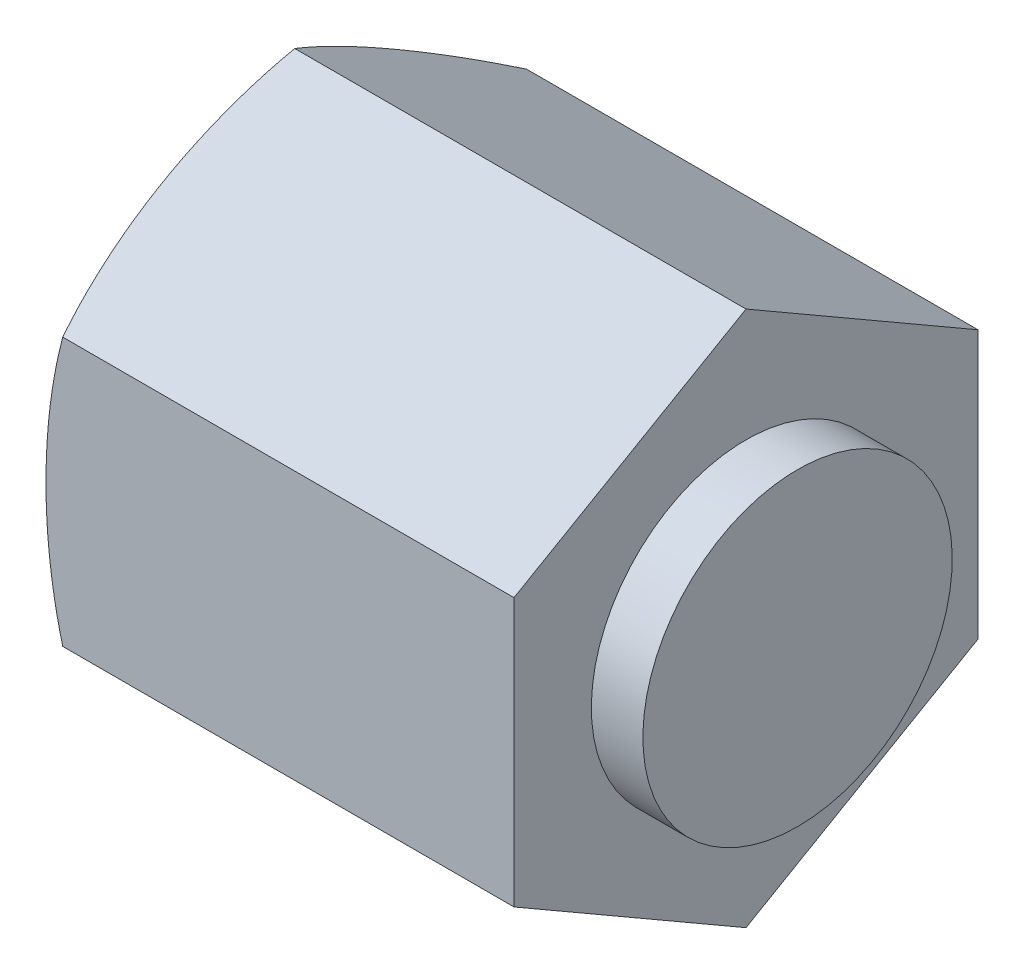
ISO-10303-21;
HEADER;
FILE_DESCRIPTION(('STEP AP214'),'2;1');
FILE_NAME('part.step','',(''),(''),'','','');
FILE_SCHEMA(('AUTOMOTIVE_DESIGN { 1 0 10303 214 1 1 1 1 }'));
ENDSEC;
DATA;
#1=APPLICATION_CONTEXT('core data for automotive mechanical design processes');
#2=APPLICATION_PROTOCOL_DEFINITION('international standard','automotive_design',2000,#1);
#3=PRODUCT_CONTEXT('',#1,'mechanical');
#4=PRODUCT('Part','Part','',(#3));
#5=PRODUCT_RELATED_PRODUCT_CATEGORY('part','',(#4));
#6=PRODUCT_DEFINITION_FORMATION('','',#4);
#7=PRODUCT_DEFINITION_CONTEXT('part definition',#1,'design');
#8=PRODUCT_DEFINITION('design','',#6,#7);
#9=PRODUCT_DEFINITION_SHAPE('','',#8);
#10=(LENGTH_UNIT() NAMED_UNIT(*) SI_UNIT(.MILLI.,.METRE.));
#11=(NAMED_UNIT(*) PLANE_ANGLE_UNIT() SI_UNIT($,.RADIAN.));
#12=(NAMED_UNIT(*) SI_UNIT($,.STERADIAN.) SOLID_ANGLE_UNIT());
#13=UNCERTAINTY_MEASURE_WITH_UNIT(LENGTH_MEASURE(1.E-05),#10,'distance_accuracy_value','');
#14=(GEOMETRIC_REPRESENTATION_CONTEXT(3) GLOBAL_UNCERTAINTY_ASSIGNED_CONTEXT((#13)) GLOBAL_UNIT_ASSIGNED_CONTEXT((#10,
#11,#12)) REPRESENTATION_CONTEXT('',''));
#15=CARTESIAN_POINT('',(0.,0.,0.));
#16=DIRECTION('',(0.,0.,1.));
#17=DIRECTION('',(1.,0.,0.));
#18=AXIS2_PLACEMENT_3D('',#15,#16,#17);
#19=CARTESIAN_POINT('',(-19.75,0.,3.4999999217689));
#20=DIRECTION('',(1.,0.,0.));
#21=DIRECTION('',(0.,0.,-1.));
#22=AXIS2_PLACEMENT_3D('',#19,#20,#21);
#23=PLANE('',#22);
#24=CARTESIAN_POINT('',(-19.75,0.,3.4999999217689));
#25=DIRECTION('',(-1.,0.,0.));
#26=DIRECTION('',(0.,-1.,0.));
#27=AXIS2_PLACEMENT_3D('',#24,#25,#26);
#28=CIRCLE('',#27,1.5);
#29=CARTESIAN_POINT('',(-19.75,-1.5,3.4999999217689));
#30=VERTEX_POINT('',#29);
#31=EDGE_CURVE('E385',#30,#30,#28,.T.);
#32=ORIENTED_EDGE('',*,*,#31,.F.);
#33=EDGE_LOOP('',(#32));
#34=FACE_BOUND('',#33,.T.);
#35=ADVANCED_FACE('F17',(#34),#23,.T.);
#36=CARTESIAN_POINT('',(-20.25,0.,3.4999999217689));
#37=DIRECTION('',(1.,0.,0.));
#38=DIRECTION('',(0.,0.,-1.));
#39=AXIS2_PLACEMENT_3D('',#36,#37,#38);
#40=CYLINDRICAL_SURFACE('',#39,1.5);
#41=CARTESIAN_POINT('',(-20.25,0.,3.4999999217689));
#42=DIRECTION('',(1.,0.,0.));
#43=DIRECTION('',(0.,-1.,0.));
#44=AXIS2_PLACEMENT_3D('',#41,#42,#43);
#45=CIRCLE('',#44,1.5);
#46=CARTESIAN_POINT('',(-20.25,-1.5,3.4999999217689));
#47=VERTEX_POINT('',#46);
#48=EDGE_CURVE('E202',#47,#47,#45,.T.);
#49=ORIENTED_EDGE('',*,*,#48,.T.);
#50=EDGE_LOOP('',(#49));
#51=FACE_BOUND('',#50,.T.);
#52=ORIENTED_EDGE('',*,*,#31,.T.);
#53=EDGE_LOOP('',(#52));
#54=FACE_BOUND('',#53,.T.);
#55=ADVANCED_FACE('F208',(#51,#54),#40,.T.);
#56=CARTESIAN_POINT('',(-25.25,0.,3.4999999217689));
#57=DIRECTION('',(0.,-1.,0.));
#58=DIRECTION('',(0.,0.,-1.));
#59=AXIS2_PLACEMENT_3D('',#56,#57,#58);
#60=SPHERICAL_SURFACE('',#59,0.5);
#61=CARTESIAN_POINT('',(-25.25,-0.5,3.4999999217689));
#62=CARTESIAN_POINT('',(-25.25,-0.50000018026659,3.50825930817007));
#63=CARTESIAN_POINT('',(-25.25,-0.49979535445461,3.51651867908556));
#64=CARTESIAN_POINT('',(-25.25,-0.498976985048431,3.53301714979241));
#65=CARTESIAN_POINT('',(-25.25,-0.498363441454231,3.54125624958378));
#66=CARTESIAN_POINT('',(-25.25,-0.496728930858526,3.5576939378896));
#67=CARTESIAN_POINT('',(-25.25,-0.495707963857022,3.56589252640407));
#68=CARTESIAN_POINT('',(-25.25,-0.493261170072825,3.5822290648079));
#69=CARTESIAN_POINT('',(-25.25,-0.491835343290132,3.59036701469727));
#70=CARTESIAN_POINT('',(-25.25,-0.488582315579929,3.60656229381656));
#71=CARTESIAN_POINT('',(-25.25,-0.486755114652419,3.61461962304648));
#72=CARTESIAN_POINT('',(-25.25,-0.482703829097227,3.63063387771955));
#73=CARTESIAN_POINT('',(-25.25,-0.480479744469544,3.63859080316271));
#74=CARTESIAN_POINT('',(-25.25,-0.475640151262357,3.65438471340208));
#75=CARTESIAN_POINT('',(-25.25,-0.473024642682851,3.66222169819828));
#76=CARTESIAN_POINT('',(-25.25,-0.467408623778611,3.67775648484459));
#77=CARTESIAN_POINT('',(-25.25,-0.464408113453877,3.68545428669469));
#78=CARTESIAN_POINT('',(-25.25,-0.458029458194628,3.70069180687179));
#79=CARTESIAN_POINT('',(-25.25,-0.454651313260113,3.7082315251988));
#80=CARTESIAN_POINT('',(-25.25,-0.447525683240186,3.72313436589687));
#81=CARTESIAN_POINT('',(-25.25,-0.443778198154773,3.73049748826794));
#82=CARTESIAN_POINT('',(-25.25,-0.435923089077585,3.74502905824429));
#83=CARTESIAN_POINT('',(-25.25,-0.431815465085809,3.75219750584957));
#84=CARTESIAN_POINT('',(-25.25,-0.423250163839689,3.76632212538224));
#85=CARTESIAN_POINT('',(-25.25,-0.418792486585343,3.77327829730963));
#86=CARTESIAN_POINT('',(-25.25,-0.409538023443418,3.78696128612127));
#87=CARTESIAN_POINT('',(-25.25,-0.404741237555838,3.79368810300551));
#88=CARTESIAN_POINT('',(-25.25,-0.39482033628501,3.8068958642295));
#89=CARTESIAN_POINT('',(-25.25,-0.389696220901763,3.81337680856924));
#90=CARTESIAN_POINT('',(-25.25,-0.379133236432991,3.82607691566235));
#91=CARTESIAN_POINT('',(-25.25,-0.373694367347468,3.8322960784157));
#92=CARTESIAN_POINT('',(-25.25,-0.362515250373856,3.84445733827456));
#93=CARTESIAN_POINT('',(-25.25,-0.356775002485768,3.85039943538005));
#94=CARTESIAN_POINT('',(-25.25,-0.345007144691811,3.86199202651301));
#95=CARTESIAN_POINT('',(-25.25,-0.338979534785941,3.86764252054048));
#96=CARTESIAN_POINT('',(-25.25,-0.326652041408771,3.87863783645894));
#97=CARTESIAN_POINT('',(-25.25,-0.320352157937471,3.88398265834992));
#98=CARTESIAN_POINT('',(-25.25,-0.306142780356244,3.89544460187941));
#99=CARTESIAN_POINT('',(-25.25,-0.298173363233864,3.90148781591163));
#100=CARTESIAN_POINT('',(-25.25,-0.284735796954727,3.91105685963379));
#101=CARTESIAN_POINT('',(-25.25,-0.279367479518132,3.91472402437504));
#102=CARTESIAN_POINT('',(-25.25,-0.267043383475654,3.92279486781706));
#103=CARTESIAN_POINT('',(-25.25,-0.26004554173319,3.92713463995664));
#104=CARTESIAN_POINT('',(-25.25,-0.24584434643569,3.93546326817931));
#105=CARTESIAN_POINT('',(-25.25,-0.238640992880654,3.93945212426241));
#106=CARTESIAN_POINT('',(-25.25,-0.224046087175708,3.94706938621248));
#107=CARTESIAN_POINT('',(-25.25,-0.216654535025799,3.95069779207947));
#108=CARTESIAN_POINT('',(-25.25,-0.201701325776029,3.95758525274126));
#109=CARTESIAN_POINT('',(-25.25,-0.194139668676168,3.96084430753607));
#110=CARTESIAN_POINT('',(-25.25,-0.178864677654324,3.96698513114222));
#111=CARTESIAN_POINT('',(-25.25,-0.171151343732339,3.96986689995355));
#112=CARTESIAN_POINT('',(-25.25,-0.155591797153019,3.97524612193083));
#113=CARTESIAN_POINT('',(-25.25,-0.147745584495683,3.97774357509677));
#114=CARTESIAN_POINT('',(-25.25,-0.13193948278754,3.98234806777002));
#115=CARTESIAN_POINT('',(-25.25,-0.123979593736732,3.98445510727732));
#116=CARTESIAN_POINT('',(-25.25,-0.107965298023249,3.98827366416714));
#117=CARTESIAN_POINT('',(-25.25,-0.0999108913605736,3.98998518154966));
#118=CARTESIAN_POINT('',(-25.25,-0.0852209712738059,3.99272952118008));
#119=CARTESIAN_POINT('',(-25.25,-0.0785978385618002,3.99382930197298));
#120=CARTESIAN_POINT('',(-25.25,-0.0631250893763249,3.99607936831134));
#121=CARTESIAN_POINT('',(-25.25,-0.0542602885152907,3.99712709144641));
#122=CARTESIAN_POINT('',(-25.25,-0.0378721849423645,3.99862047804996));
#123=CARTESIAN_POINT('',(-25.25,-0.0303549858006175,3.99913449638668));
#124=CARTESIAN_POINT('',(-25.25,-0.015304920978207,3.9998223897275));
#125=CARTESIAN_POINT('',(-25.25,-0.0077720552975436,3.99999626473159));
#126=CARTESIAN_POINT('',(-25.25,0.00729397879890349,4.00000346452763));
#127=CARTESIAN_POINT('',(-25.25,0.0148271472146871,3.99983678931958));
#128=CARTESIAN_POINT('',(-25.25,0.0270036201884411,3.99929190484954));
#129=CARTESIAN_POINT('',(-25.25,0.0316518378888337,3.99901879332132));
#130=CARTESIAN_POINT('',(-25.25,0.0392366506859461,3.99846675565542));
#131=CARTESIAN_POINT('',(-25.25,0.0421761309230652,3.99822665348292));
#132=CARTESIAN_POINT('',(-25.25,0.0528030307401045,3.99726388147692));
#133=CARTESIAN_POINT('',(-25.25,0.0604773336661282,3.99638898311102));
#134=CARTESIAN_POINT('',(-25.25,0.0759245550098736,3.99426445663315));
#135=CARTESIAN_POINT('',(-25.25,0.0836965096401619,3.9930079075478));
#136=CARTESIAN_POINT('',(-25.25,0.100798913351253,3.98982669443535));
#137=CARTESIAN_POINT('',(-25.25,0.110113819532657,3.98781713321561));
#138=CARTESIAN_POINT('',(-25.25,0.124044368548806,3.98439258325809));
#139=CARTESIAN_POINT('',(-25.25,0.128709216004945,3.98317399036882));
#140=CARTESIAN_POINT('',(-25.25,0.135692120419953,3.98124157162302));
#141=CARTESIAN_POINT('',(-25.25,0.138024078137029,3.98057794006303));
#142=CARTESIAN_POINT('',(-25.25,0.141517848099842,3.97955615058695));
#143=CARTESIAN_POINT('',(-25.25,0.142683376368207,3.97921066030323));
#144=CARTESIAN_POINT('',(-25.25,0.144430560875069,3.97868581413356));
#145=CARTESIAN_POINT('',(-25.25,0.145013173308696,3.97850963957852));
#146=CARTESIAN_POINT('',(-25.25,0.14588680608415,3.97824372210201));
#147=CARTESIAN_POINT('',(-25.25,0.146178069176581,3.9781547762224));
#148=CARTESIAN_POINT('',(-25.25,0.146614891281632,3.9780209431232));
#149=CARTESIAN_POINT('',(-25.25,0.146760511420319,3.97797625537742));
#150=CARTESIAN_POINT('',(-25.25,0.146978923357589,3.97790912014364));
#151=CARTESIAN_POINT('',(-25.25,0.14705173049459,3.9778867225503));
#152=CARTESIAN_POINT('',(-25.25,0.147160936614997,3.97785310025103));
#153=CARTESIAN_POINT('',(-25.25,0.147197339440235,3.97784188802197));
#154=CARTESIAN_POINT('',(-25.25,0.14725194253049,3.9778250632001));
#155=CARTESIAN_POINT('',(-25.25,0.147270143756445,3.97781945372705));
#156=CARTESIAN_POINT('',(-25.25,0.147306546081954,3.97780823254235));
#157=CARTESIAN_POINT('',(-25.25,0.14732474718149,3.97780262083064));
#158=CARTESIAN_POINT('',(-25.2500000000001,0.151930101017652,3.97638242294706));
#159=CARTESIAN_POINT('',(-25.2500000000012,0.156497041777625,3.97490172932844));
#160=CARTESIAN_POINT('',(-25.2500000000037,0.168885833187533,3.97068688424375));
#161=CARTESIAN_POINT('',(-25.2500000000045,0.176663918000326,3.9678230822664));
#162=CARTESIAN_POINT('',(-25.2500000000064,0.192067916177644,3.96171257793677));
#163=CARTESIAN_POINT('',(-25.2500000000074,0.19969382954217,3.95846587558448));
#164=CARTESIAN_POINT('',(-25.2500000000093,0.214774958289601,3.95159749535855));
#165=CARTESIAN_POINT('',(-25.2500000000101,0.222230173672506,3.9479758174849));
#166=CARTESIAN_POINT('',(-25.2500000000116,0.236951399282937,3.94036646174882));
#167=CARTESIAN_POINT('',(-25.2500000000123,0.244217409510464,3.93637878388639));
#168=CARTESIAN_POINT('',(-25.2500000000135,0.258542293003642,3.92804727485311));
#169=CARTESIAN_POINT('',(-25.250000000014,0.265601166269294,3.92370344368225));
#170=CARTESIAN_POINT('',(-25.2500000000149,0.279494326981713,3.91467036369116));
#171=CARTESIAN_POINT('',(-25.2500000000153,0.286328614428481,3.90998111487093));
#172=CARTESIAN_POINT('',(-25.250000000016,0.299755717348566,3.90026878639316));
#173=CARTESIAN_POINT('',(-25.2500000000163,0.306348532821883,3.89524570673563));
#174=CARTESIAN_POINT('',(-25.2500000000167,0.31927640025266,3.8848781289441));
#175=CARTESIAN_POINT('',(-25.2500000000168,0.32561145221012,3.8795336308101));
#176=CARTESIAN_POINT('',(-25.250000000017,0.338008138566333,3.8685364224926));
#177=CARTESIAN_POINT('',(-25.250000000017,0.344069772965085,3.8628837123091));
#178=CARTESIAN_POINT('',(-25.2500000000169,0.355904645637533,3.85128404796952));
#179=CARTESIAN_POINT('',(-25.2500000000168,0.361677883911229,3.84533709381344));
#180=CARTESIAN_POINT('',(-25.2500000000165,0.372921698445192,3.83316363668161));
#181=CARTESIAN_POINT('',(-25.2500000000163,0.37839227470546,3.82693713370586));
#182=CARTESIAN_POINT('',(-25.2500000000158,0.389017247203127,3.81421996486695));
#183=CARTESIAN_POINT('',(-25.2500000000156,0.394171643440526,3.80772929900379));
#184=CARTESIAN_POINT('',(-25.2500000000149,0.404151519179074,3.79449984307821));
#185=CARTESIAN_POINT('',(-25.2500000000146,0.408976998680224,3.78776105301579));
#186=CARTESIAN_POINT('',(-25.2500000000138,0.418287116998067,3.77405200050466));
#187=CARTESIAN_POINT('',(-25.2500000000134,0.422771755814759,3.76708173805595));
#188=CARTESIAN_POINT('',(-25.2500000000125,0.431389111046818,3.75292696456243));
#189=CARTESIAN_POINT('',(-25.250000000012,0.435521827462185,3.74574245351762));
#190=CARTESIAN_POINT('',(-25.250000000011,0.443425125786703,3.73117693603868));
#191=CARTESIAN_POINT('',(-25.2500000000105,0.447195707695854,3.72379592960455));
#192=CARTESIAN_POINT('',(-25.2500000000095,0.454365419758781,3.70885566010184));
#193=CARTESIAN_POINT('',(-25.250000000009,0.457764549912556,3.70129639703326));
#194=CARTESIAN_POINT('',(-25.2500000000079,0.464182959060329,3.68601829349429));
#195=CARTESIAN_POINT('',(-25.2500000000074,0.467202238054326,3.6782994530239));
#196=CARTESIAN_POINT('',(-25.2500000000063,0.472853484205953,3.66272126824092));
#197=CARTESIAN_POINT('',(-25.2500000000058,0.475485451363583,3.65486192392834));
#198=CARTESIAN_POINT('',(-25.2500000000049,0.480355569852364,3.63902215219238));
#199=CARTESIAN_POINT('',(-25.2500000000044,0.482593721183515,3.631041724769));
#200=CARTESIAN_POINT('',(-25.2500000000035,0.486670678567371,3.61497950681374));
#201=CARTESIAN_POINT('',(-25.250000000003,0.488509484620076,3.60689771628187));
#202=CARTESIAN_POINT('',(-25.2500000000022,0.491783203553432,3.59065274232346));
#203=CARTESIAN_POINT('',(-25.2500000000019,0.493218116434084,3.58248955889692));
#204=CARTESIAN_POINT('',(-25.2500000000012,0.495680518719172,3.56610197146092));
#205=CARTESIAN_POINT('',(-25.250000000001,0.496708008123609,3.55787756745146));
#206=CARTESIAN_POINT('',(-25.2500000000005,0.498352966936088,3.54138785880888));
#207=CARTESIAN_POINT('',(-25.2500000000003,0.49897043634413,3.53312255417575));
#208=CARTESIAN_POINT('',(-25.2500000000001,0.49979404416659,3.51657147886295));
#209=CARTESIAN_POINT('',(-25.25,0.500000182581009,3.50828570818328));
#210=CARTESIAN_POINT('',(-25.25,0.5,3.4999999217689));
#211=B_SPLINE_CURVE_WITH_KNOTS('',3,(#61,#62,#63,#64,#65,#66,#67,#68,#69,#70,#71,#72,#73,#74,
#75,#76,#77,#78,#79,#80,#81,#82,#83,#84,#85,#86,#87,#88,#89,#90,#91,#92,#93,#94,#95,#96,#97,#98,
#99,#100,#101,#102,#103,#104,#105,#106,#107,#108,#109,#110,#111,#112,#113,#114,#115,#116,#117,
#118,#119,#120,#121,#122,#123,#124,#125,#126,#127,#128,#129,#130,#131,#132,#133,#134,#135,#136,
#137,#138,#139,#140,#141,#142,#143,#144,#145,#146,#147,#148,#149,#150,#151,#152,#153,#154,#155,
#156,#157,#158,#159,#160,#161,#162,#163,#164,#165,#166,#167,#168,#169,#170,#171,#172,#173,#174,
#175,#176,#177,#178,#179,#180,#181,#182,#183,#184,#185,#186,#187,#188,#189,#190,#191,#192,#193,
#194,#195,#196,#197,#198,#199,#200,#201,#202,#203,#204,#205,#206,#207,#208,#209,#210),
.UNSPECIFIED.,.F.,.F.,(4,2,2,2,2,2,2,2,2,2,2,2,2,2,2,2,2,2,2,2,2,2,2,2,2,2,2,2,2,2,2,2,2,2,2,2,
2,2,2,2,2,2,2,2,2,2,2,2,2,2,2,2,2,2,2,2,2,2,2,2,2,2,2,2,2,2,2,2,2,2,2,2,2,2,4),(0.,
0.0247755978430253,0.0495511956860503,0.0743267935290757,0.0991023913721009,0.123877989215126,
0.148653587058151,0.173429184901176,0.198204782744202,0.222980380587227,0.247755978430252,
0.272531576273278,0.297307174116303,0.322082771959328,0.346858369802353,0.371633967645379,
0.396409565488404,0.421185163331429,0.445960761174454,0.475945687806646,0.49544542831294,
0.520137640535009,0.544829852757077,0.569522064979146,0.594214277201214,0.618906489423283,
0.643598701645351,0.66829091386742,0.692983126089488,0.713119744421702,0.73988541006185,
0.762482341874004,0.785079273686158,0.807676205498312,0.821643122448693,0.830490624968297,
0.853653287489584,0.877263979994143,0.905834073956894,0.920296513111013,0.927569889914304,
0.931216828722352,0.933042823689835,0.933956447877374,0.934413416057648,0.934641939095508,
0.934756210342117,0.934813348396184,0.934870488070292,0.949271431957903,0.974126205033512,
0.998980978109122,1.02383575118473,1.04869052426034,1.07354529733595,1.09840007041156,
1.12325484348717,1.14810961656278,1.17296438963839,1.19781916271399,1.2226739357896,
1.24752870886521,1.27238348194082,1.29723825501643,1.32209302809204,1.34694780116765,
1.37180257424326,1.39665734731887,1.42151212039448,1.44636689347009,1.4712216665457,
1.49607643962131,1.52093121269691,1.54578598577252,1.57064075884813),.UNSPECIFIED.);
#212=CARTESIAN_POINT('',(-25.25,0.499999994412064,3.4999999217689));
#213=VERTEX_POINT('',#212);
#214=CARTESIAN_POINT('',(-25.25,-0.499999994412064,3.4999999217689));
#215=VERTEX_POINT('',#214);
#216=EDGE_CURVE('E180',#213,#215,#211,.F.);
#217=ORIENTED_EDGE('',*,*,#216,.F.);
#218=CARTESIAN_POINT('',(-25.25,0.5,3.4999999217689));
#219=CARTESIAN_POINT('',(-25.25,0.500000173544388,3.49181868263845));
#220=CARTESIAN_POINT('',(-25.25,0.499799208562576,3.48363745827494));
#221=CARTESIAN_POINT('',(-25.25,0.498996247642596,3.46729471093545));
#222=CARTESIAN_POINT('',(-25.25,0.498394251704427,3.45913318795947));
#223=CARTESIAN_POINT('',(-25.25,0.49679047496777,3.44284951524877));
#224=CARTESIAN_POINT('',(-25.25,0.495788694169282,3.43472736551403));
#225=CARTESIAN_POINT('',(-25.25,0.493387815795499,3.41854200356841));
#226=CARTESIAN_POINT('',(-25.25,0.491988718220203,3.41047879135751));
#227=CARTESIAN_POINT('',(-25.25,0.488796562183028,3.39443073016416));
#228=CARTESIAN_POINT('',(-25.25,0.487003503721148,3.3864458811817));
#229=CARTESIAN_POINT('',(-25.25,0.483027749473396,3.37057378245284));
#230=CARTESIAN_POINT('',(-25.25,0.480845053687522,3.36268653270644));
#231=CARTESIAN_POINT('',(-25.25,0.476095282044687,3.3470286335769));
#232=CARTESIAN_POINT('',(-25.25,0.473528206187724,3.33925798419375));
#233=CARTESIAN_POINT('',(-25.25,0.468015858995296,3.32385200595183));
#234=CARTESIAN_POINT('',(-25.25,0.46507058765983,3.31621667709307));
#235=CARTESIAN_POINT('',(-25.25,0.458808944851456,3.30109973407964));
#236=CARTESIAN_POINT('',(-25.25,0.455492573378548,3.29361811992497));
#237=CARTESIAN_POINT('',(-25.25,0.448496719744895,3.27882663018255));
#238=CARTESIAN_POINT('',(-25.25,0.444817237584149,3.27151675459479));
#239=CARTESIAN_POINT('',(-25.25,0.437104026764206,3.25708635211701));
#240=CARTESIAN_POINT('',(-25.25,0.433070298105007,3.24996582522699));
#241=CARTESIAN_POINT('',(-25.25,0.424658311895265,3.23593127411758));
#242=CARTESIAN_POINT('',(-25.25,0.42028005434472,3.22901724989819));
#243=CARTESIAN_POINT('',(-25.25,0.411189557957825,3.21541236062));
#244=CARTESIAN_POINT('',(-25.25,0.406477319121474,3.2087214955612));
#245=CARTESIAN_POINT('',(-25.25,0.396730212359171,3.19557904348416));
#246=CARTESIAN_POINT('',(-25.25,0.391695344433218,3.18912745646593));
#247=CARTESIAN_POINT('',(-25.25,0.381315108929519,3.17647910290823));
#248=CARTESIAN_POINT('',(-25.25,0.375969741351772,3.17028233636877));
#249=CARTESIAN_POINT('',(-25.25,0.364981384003187,3.15815855232201));
#250=CARTESIAN_POINT('',(-25.25,0.359338394232348,3.1522315348147));
#251=CARTESIAN_POINT('',(-25.25,0.3477683869542,3.14066152753655));
#252=CARTESIAN_POINT('',(-25.25,0.341841369446892,3.13501853776571));
#253=CARTESIAN_POINT('',(-25.25,0.329717585400127,3.12403018041713));
#254=CARTESIAN_POINT('',(-25.25,0.32352081886067,3.11868481283938));
#255=CARTESIAN_POINT('',(-25.25,0.310872465302975,3.10830457733568));
#256=CARTESIAN_POINT('',(-25.25,0.304420878284736,3.10326970940973));
#257=CARTESIAN_POINT('',(-25.25,0.291278426207697,3.09352260264743));
#258=CARTESIAN_POINT('',(-25.25,0.284587561148896,3.08881036381108));
#259=CARTESIAN_POINT('',(-25.25,0.270982671870706,3.07971986742418));
#260=CARTESIAN_POINT('',(-25.25,0.264068647651315,3.07534160987364));
#261=CARTESIAN_POINT('',(-25.25,0.250034096541906,3.06692962366389));
#262=CARTESIAN_POINT('',(-25.25,0.242913569651887,3.06289589500469));
#263=CARTESIAN_POINT('',(-25.25,0.228483167174111,3.05518268418475));
#264=CARTESIAN_POINT('',(-25.25,0.221173291586354,3.05150320202401));
#265=CARTESIAN_POINT('',(-25.25,0.206381801843928,3.04450734839035));
#266=CARTESIAN_POINT('',(-25.25,0.19890018768926,3.04119097691744));
#267=CARTESIAN_POINT('',(-25.25,0.183783244675829,3.03492933410907));
#268=CARTESIAN_POINT('',(-25.25,0.176147915817066,3.0319840627736));
#269=CARTESIAN_POINT('',(-25.25,0.160741937575154,3.02647171558118));
#270=CARTESIAN_POINT('',(-25.25,0.152971288192004,3.02390463972421));
#271=CARTESIAN_POINT('',(-25.25,0.137313389062458,3.01915486808138));
#272=CARTESIAN_POINT('',(-25.25,0.129426139316061,3.0169721722955));
#273=CARTESIAN_POINT('',(-25.25,0.113554040587203,3.01299641804775));
#274=CARTESIAN_POINT('',(-25.25,0.105569191604741,3.01120335958587));
#275=CARTESIAN_POINT('',(-25.25,0.089521130411387,3.0080112035487));
#276=CARTESIAN_POINT('',(-25.25,0.0814579182004942,3.0066121059734));
#277=CARTESIAN_POINT('',(-25.25,0.0652725562548674,3.00421122759962));
#278=CARTESIAN_POINT('',(-25.25,0.0571504065201335,3.00320944680113));
#279=CARTESIAN_POINT('',(-25.25,0.040866733809427,3.00160567006447));
#280=CARTESIAN_POINT('',(-25.25,0.0327052108334544,3.0010036741263));
#281=CARTESIAN_POINT('',(-25.25,0.0163624634939634,3.00020071320632));
#282=CARTESIAN_POINT('',(-25.25,0.00818123913044501,2.99999974822451));
#283=CARTESIAN_POINT('',(-25.25,0.,2.9999999217689));
#284=B_SPLINE_CURVE_WITH_KNOTS('',3,(#218,#219,#220,#221,#222,#223,#224,#225,#226,#227,#228,
#229,#230,#231,#232,#233,#234,#235,#236,#237,#238,#239,#240,#241,#242,#243,#244,#245,#246,#247,
#248,#249,#250,#251,#252,#253,#254,#255,#256,#257,#258,#259,#260,#261,#262,#263,#264,#265,#266,
#267,#268,#269,#270,#271,#272,#273,#274,#275,#276,#277,#278,#279,#280,#281,#282,#283),
.UNSPECIFIED.,.F.,.F.,(4,2,2,2,2,2,2,2,2,2,2,2,2,2,2,2,2,2,2,2,2,2,2,2,2,2,2,2,2,2,2,2,4),(0.,
0.0245412285229125,0.0490824570458248,0.0736236855687368,0.0981649140916492,0.122706142614562,
0.147247371137474,0.171788599660386,0.196329828183298,0.220871056706211,0.245412285229123,
0.269953513752035,0.294494742274947,0.31903597079786,0.343577199320772,0.368118427843684,
0.392659656366597,0.417200884889509,0.441742113412421,0.466283341935334,0.490824570458246,
0.515365798981158,0.53990702750407,0.564448256026983,0.588989484549895,0.613530713072807,
0.638071941595719,0.662613170118632,0.687154398641544,0.711695627164456,0.736236855687369,
0.760778084210281,0.785319312733193),.UNSPECIFIED.);
#285=CARTESIAN_POINT('',(-25.25,0.,2.9999999217689));
#286=VERTEX_POINT('',#285);
#287=EDGE_CURVE('E36',#286,#213,#284,.F.);
#288=ORIENTED_EDGE('',*,*,#287,.F.);
#289=CARTESIAN_POINT('',(-25.25,0.,2.9999999217689));
#290=CARTESIAN_POINT('',(-25.25,-0.00818123913044511,2.99999974822451));
#291=CARTESIAN_POINT('',(-25.25,-0.0163624634939636,3.00020071320632));
#292=CARTESIAN_POINT('',(-25.25,-0.0327052108334546,3.0010036741263));
#293=CARTESIAN_POINT('',(-25.25,-0.0408667338094271,3.00160567006447));
#294=CARTESIAN_POINT('',(-25.25,-0.0571504065201336,3.00320944680113));
#295=CARTESIAN_POINT('',(-25.25,-0.0652725562548676,3.00421122759962));
#296=CARTESIAN_POINT('',(-25.25,-0.0814579182004943,3.0066121059734));
#297=CARTESIAN_POINT('',(-25.25,-0.0895211304113871,3.0080112035487));
#298=CARTESIAN_POINT('',(-25.25,-0.105569191604741,3.01120335958587));
#299=CARTESIAN_POINT('',(-25.25,-0.113554040587203,3.01299641804775));
#300=CARTESIAN_POINT('',(-25.25,-0.129426139316061,3.0169721722955));
#301=CARTESIAN_POINT('',(-25.25,-0.137313389062458,3.01915486808138));
#302=CARTESIAN_POINT('',(-25.25,-0.152971288192004,3.02390463972421));
#303=CARTESIAN_POINT('',(-25.25,-0.160741937575154,3.02647171558118));
#304=CARTESIAN_POINT('',(-25.25,-0.176147915817066,3.0319840627736));
#305=CARTESIAN_POINT('',(-25.25,-0.183783244675829,3.03492933410907));
#306=CARTESIAN_POINT('',(-25.25,-0.19890018768926,3.04119097691744));
#307=CARTESIAN_POINT('',(-25.25,-0.206381801843929,3.04450734839035));
#308=CARTESIAN_POINT('',(-25.25,-0.221173291586354,3.05150320202401));
#309=CARTESIAN_POINT('',(-25.25,-0.228483167174111,3.05518268418475));
#310=CARTESIAN_POINT('',(-25.25,-0.242913569651887,3.06289589500469));
#311=CARTESIAN_POINT('',(-25.25,-0.250034096541906,3.06692962366389));
#312=CARTESIAN_POINT('',(-25.25,-0.264068647651316,3.07534160987364));
#313=CARTESIAN_POINT('',(-25.25,-0.270982671870706,3.07971986742418));
#314=CARTESIAN_POINT('',(-25.25,-0.284587561148897,3.08881036381108));
#315=CARTESIAN_POINT('',(-25.25,-0.291278426207697,3.09352260264743));
#316=CARTESIAN_POINT('',(-25.25,-0.304420878284736,3.10326970940973));
#317=CARTESIAN_POINT('',(-25.25,-0.310872465302975,3.10830457733568));
#318=CARTESIAN_POINT('',(-25.25,-0.32352081886067,3.11868481283938));
#319=CARTESIAN_POINT('',(-25.25,-0.329717585400127,3.12403018041713));
#320=CARTESIAN_POINT('',(-25.25,-0.341841369446892,3.13501853776571));
#321=CARTESIAN_POINT('',(-25.25,-0.3477683869542,3.14066152753655));
#322=CARTESIAN_POINT('',(-25.25,-0.359338394232348,3.1522315348147));
#323=CARTESIAN_POINT('',(-25.25,-0.364981384003187,3.15815855232201));
#324=CARTESIAN_POINT('',(-25.25,-0.375969741351772,3.17028233636877));
#325=CARTESIAN_POINT('',(-25.25,-0.381315108929519,3.17647910290823));
#326=CARTESIAN_POINT('',(-25.25,-0.391695344433218,3.18912745646593));
#327=CARTESIAN_POINT('',(-25.25,-0.396730212359171,3.19557904348416));
#328=CARTESIAN_POINT('',(-25.25,-0.406477319121474,3.2087214955612));
#329=CARTESIAN_POINT('',(-25.25,-0.411189557957825,3.21541236062));
#330=CARTESIAN_POINT('',(-25.25,-0.42028005434472,3.22901724989819));
#331=CARTESIAN_POINT('',(-25.25,-0.424658311895265,3.23593127411758));
#332=CARTESIAN_POINT('',(-25.25,-0.433070298105007,3.24996582522699));
#333=CARTESIAN_POINT('',(-25.25,-0.437104026764206,3.25708635211701));
#334=CARTESIAN_POINT('',(-25.25,-0.444817237584149,3.27151675459479));
#335=CARTESIAN_POINT('',(-25.25,-0.448496719744895,3.27882663018255));
#336=CARTESIAN_POINT('',(-25.25,-0.455492573378548,3.29361811992497));
#337=CARTESIAN_POINT('',(-25.25,-0.458808944851456,3.30109973407964));
#338=CARTESIAN_POINT('',(-25.25,-0.46507058765983,3.31621667709307));
#339=CARTESIAN_POINT('',(-25.25,-0.468015858995296,3.32385200595183));
#340=CARTESIAN_POINT('',(-25.25,-0.473528206187724,3.33925798419375));
#341=CARTESIAN_POINT('',(-25.25,-0.476095282044687,3.3470286335769));
#342=CARTESIAN_POINT('',(-25.25,-0.480845053687522,3.36268653270644));
#343=CARTESIAN_POINT('',(-25.25,-0.483027749473396,3.37057378245284));
#344=CARTESIAN_POINT('',(-25.25,-0.487003503721148,3.3864458811817));
#345=CARTESIAN_POINT('',(-25.25,-0.488796562183028,3.39443073016416));
#346=CARTESIAN_POINT('',(-25.25,-0.491988718220203,3.41047879135751));
#347=CARTESIAN_POINT('',(-25.25,-0.493387815795499,3.41854200356841));
#348=CARTESIAN_POINT('',(-25.25,-0.495788694169282,3.43472736551403));
#349=CARTESIAN_POINT('',(-25.25,-0.49679047496777,3.44284951524877));
#350=CARTESIAN_POINT('',(-25.25,-0.498394251704427,3.45913318795947));
#351=CARTESIAN_POINT('',(-25.25,-0.498996247642596,3.46729471093545));
#352=CARTESIAN_POINT('',(-25.25,-0.499799208562576,3.48363745827494));
#353=CARTESIAN_POINT('',(-25.25,-0.500000173544388,3.49181868263845));
#354=CARTESIAN_POINT('',(-25.25,-0.5,3.4999999217689));
#355=B_SPLINE_CURVE_WITH_KNOTS('',3,(#289,#290,#291,#292,#293,#294,#295,#296,#297,#298,#299,
#300,#301,#302,#303,#304,#305,#306,#307,#308,#309,#310,#311,#312,#313,#314,#315,#316,#317,#318,
#319,#320,#321,#322,#323,#324,#325,#326,#327,#328,#329,#330,#331,#332,#333,#334,#335,#336,#337,
#338,#339,#340,#341,#342,#343,#344,#345,#346,#347,#348,#349,#350,#351,#352,#353,#354),
.UNSPECIFIED.,.F.,.F.,(4,2,2,2,2,2,2,2,2,2,2,2,2,2,2,2,2,2,2,2,2,2,2,2,2,2,2,2,2,2,2,2,4),(0.,
0.0245412285229123,0.0490824570458246,0.073623685568737,0.0981649140916492,0.122706142614561,
0.147247371137474,0.171788599660386,0.196329828183298,0.220871056706211,0.245412285229123,
0.269953513752035,0.294494742274948,0.31903597079786,0.343577199320772,0.368118427843684,
0.392659656366597,0.417200884889509,0.441742113412421,0.466283341935334,0.490824570458246,
0.515365798981158,0.53990702750407,0.564448256026983,0.588989484549895,0.613530713072807,
0.638071941595719,0.662613170118632,0.687154398641544,0.711695627164456,0.736236855687369,
0.760778084210281,0.785319312733193),.UNSPECIFIED.);
#356=EDGE_CURVE('E166',#215,#286,#355,.F.);
#357=ORIENTED_EDGE('',*,*,#356,.F.);
#358=EDGE_LOOP('',(#217,#288,#357));
#359=FACE_BOUND('',#358,.T.);
#360=ADVANCED_FACE('F138',(#359),#60,.T.);
#361=CARTESIAN_POINT('',(-20.25,0.,3.5));
#362=DIRECTION('',(-1.,0.,0.));
#363=DIRECTION('',(0.,0.,1.));
#364=AXIS2_PLACEMENT_3D('',#361,#362,#363);
#365=PLANE('',#364);
#366=ORIENTED_EDGE('',*,*,#48,.F.);
#367=EDGE_LOOP('',(#366));
#368=FACE_BOUND('',#367,.T.);
#369=DIRECTION('',(0.,-0.499999999999999,-0.866025403784439));
#370=VECTOR('',#369,1.);
#371=CARTESIAN_POINT('',(-20.25,-2.59807621135332,3.5));
#372=LINE('',#371,#370);
#373=CARTESIAN_POINT('',(-20.25,-2.59807621135332,3.5));
#374=VERTEX_POINT('',#373);
#375=CARTESIAN_POINT('',(-20.25,-1.29903810567666,5.75));
#376=VERTEX_POINT('',#375);
#377=EDGE_CURVE('E106',#374,#376,#372,.F.);
#378=ORIENTED_EDGE('',*,*,#377,.F.);
#379=DIRECTION('',(0.,0.500000000000001,-0.866025403784438));
#380=VECTOR('',#379,1.);
#381=CARTESIAN_POINT('',(-20.25,-1.29903810567666,1.25));
#382=LINE('',#381,#380);
#383=CARTESIAN_POINT('',(-20.25,-1.29903810567666,1.25));
#384=VERTEX_POINT('',#383);
#385=EDGE_CURVE('E156',#384,#374,#382,.F.);
#386=ORIENTED_EDGE('',*,*,#385,.F.);
#387=DIRECTION('',(0.,1.,0.));
#388=VECTOR('',#387,1.);
#389=CARTESIAN_POINT('',(-20.25,1.29903810567666,1.25));
#390=LINE('',#389,#388);
#391=CARTESIAN_POINT('',(-20.25,1.29903810567666,1.25));
#392=VERTEX_POINT('',#391);
#393=EDGE_CURVE('E119',#392,#384,#390,.F.);
#394=ORIENTED_EDGE('',*,*,#393,.F.);
#395=DIRECTION('',(0.,0.5,0.866025403784439));
#396=VECTOR('',#395,1.);
#397=CARTESIAN_POINT('',(-20.25,2.59807621135332,3.5));
#398=LINE('',#397,#396);
#399=CARTESIAN_POINT('',(-20.25,2.59807621135332,3.5));
#400=VERTEX_POINT('',#399);
#401=EDGE_CURVE('E101',#400,#392,#398,.F.);
#402=ORIENTED_EDGE('',*,*,#401,.F.);
#403=DIRECTION('',(0.,-0.5,0.866025403784439));
#404=VECTOR('',#403,1.);
#405=CARTESIAN_POINT('',(-20.25,1.29903810567666,5.75));
#406=LINE('',#405,#404);
#407=CARTESIAN_POINT('',(-20.25,1.29903810567666,5.75));
#408=VERTEX_POINT('',#407);
#409=EDGE_CURVE('E96',#408,#400,#406,.F.);
#410=ORIENTED_EDGE('',*,*,#409,.F.);
#411=DIRECTION('',(0.,-1.,0.));
#412=VECTOR('',#411,1.);
#413=CARTESIAN_POINT('',(-20.25,-1.29903810567666,5.75));
#414=LINE('',#413,#412);
#415=EDGE_CURVE('E91',#376,#408,#414,.F.);
#416=ORIENTED_EDGE('',*,*,#415,.F.);
#417=EDGE_LOOP('',(#378,#386,#394,#402,#410,#416));
#418=FACE_BOUND('',#417,.T.);
#419=ADVANCED_FACE('F99',(#368,#418),#365,.F.);
#420=CARTESIAN_POINT('',(-25.25,0.,3.5));
#421=DIRECTION('',(-1.,0.,0.));
#422=DIRECTION('',(0.,0.,1.));
#423=AXIS2_PLACEMENT_3D('',#420,#421,#422);
#424=PLANE('',#423);
#425=ORIENTED_EDGE('',*,*,#287,.T.);
#426=ORIENTED_EDGE('',*,*,#216,.T.);
#427=ORIENTED_EDGE('',*,*,#356,.T.);
#428=EDGE_LOOP('',(#425,#426,#427));
#429=FACE_BOUND('',#428,.T.);
#430=CARTESIAN_POINT('',(-25.2499999999845,0.,3.5));
#431=DIRECTION('',(1.,0.,0.));
#432=DIRECTION('',(0.,0.,-1.));
#433=AXIS2_PLACEMENT_3D('',#430,#431,#432);
#434=CIRCLE('',#433,0.561137618512987);
#435=CARTESIAN_POINT('',(-25.2499999999845,0.,2.93886238148701));
#436=VERTEX_POINT('',#435);
#437=EDGE_CURVE('E21',#436,#436,#434,.F.);
#438=ORIENTED_EDGE('',*,*,#437,.T.);
#439=EDGE_LOOP('',(#438));
#440=FACE_BOUND('',#439,.T.);
#441=ADVANCED_FACE('F123',(#429,#440),#424,.T.);
#442=CARTESIAN_POINT('',(-20.25,1.29903810567666,5.75));
#443=DIRECTION('',(0.,0.866025403784439,0.5));
#444=DIRECTION('',(0.,-0.5,0.866025403784439));
#445=AXIS2_PLACEMENT_3D('',#442,#443,#444);
#446=PLANE('',#445);
#447=ORIENTED_EDGE('',*,*,#409,.T.);
#448=DIRECTION('',(1.,0.,0.));
#449=VECTOR('',#448,1.);
#450=CARTESIAN_POINT('',(-20.25,2.59807621135332,3.5));
#451=LINE('',#450,#449);
#452=CARTESIAN_POINT('',(-24.6263817031425,2.59807621135332,3.5));
#453=VERTEX_POINT('',#452);
#454=EDGE_CURVE('E304',#453,#400,#451,.T.);
#455=ORIENTED_EDGE('',*,*,#454,.F.);
#456=CARTESIAN_POINT('',(-24.6263817031425,2.59807621135332,3.5));
#457=CARTESIAN_POINT('',(-24.6427233762004,2.56727941644858,3.55334161348529));
#458=CARTESIAN_POINT('',(-24.6577128471821,2.5363099766986,3.6069822566142));
#459=CARTESIAN_POINT('',(-24.6851170150146,2.47409294304915,3.71474531999126));
#460=CARTESIAN_POINT('',(-24.6975321783225,2.44284540061311,3.76886765110215));
#461=CARTESIAN_POINT('',(-24.7311048467652,2.3488082236275,3.93174481944157));
#462=CARTESIAN_POINT('',(-24.748609417388,2.28568578850012,4.04107608417966));
#463=CARTESIAN_POINT('',(-24.7742395047372,2.16010374441629,4.25859056505122));
#464=CARTESIAN_POINT('',(-24.7825246028534,2.09765201047597,4.36676014125664));
#465=CARTESIAN_POINT('',(-24.7904790301423,1.9726018360811,4.58335339680388));
#466=CARTESIAN_POINT('',(-24.7901476146396,1.91000338341397,4.6917770972985));
#467=CARTESIAN_POINT('',(-24.7820875788508,1.80154200012182,4.87963772381971));
#468=CARTESIAN_POINT('',(-24.7763423024698,1.75563972215398,4.95914280144318));
#469=CARTESIAN_POINT('',(-24.7601077502724,1.664058417928,5.11776627338603));
#470=CARTESIAN_POINT('',(-24.7496200549015,1.61837932241479,5.19688478765869));
#471=CARTESIAN_POINT('',(-24.723566267536,1.52676879507645,5.35555887551687));
#472=CARTESIAN_POINT('',(-24.7079353416706,1.48084191763119,5.43510656068506));
#473=CARTESIAN_POINT('',(-24.6712859639651,1.3895008875534,5.59331386559546));
#474=CARTESIAN_POINT('',(-24.6502641473314,1.34408707370661,5.67197289854359));
#475=CARTESIAN_POINT('',(-24.6263817031425,1.29903810567666,5.74999999999999));
#476=B_SPLINE_CURVE_WITH_KNOTS('',3,(#456,#457,#458,#459,#460,#461,#462,#463,#464,#465,#466,
#467,#468,#469,#470,#471,#472,#473,#474,#475),.UNSPECIFIED.,.F.,.F.,(4,2,2,2,2,2,2,2,2,4),(0.,
0.191136279908619,0.382237896159326,0.764204674919871,1.13945179117789,1.51473133797989,
1.7905711717524,2.06631914756684,2.34568554537507,2.62522673951164),.UNSPECIFIED.);
#477=CARTESIAN_POINT('',(-24.6263817031425,1.29903810567666,5.75));
#478=VERTEX_POINT('',#477);
#479=EDGE_CURVE('E74',#453,#478,#476,.T.);
#480=ORIENTED_EDGE('',*,*,#479,.T.);
#481=DIRECTION('',(1.,0.,0.));
#482=VECTOR('',#481,1.);
#483=CARTESIAN_POINT('',(-20.25,1.29903810567666,5.75));
#484=LINE('',#483,#482);
#485=EDGE_CURVE('E66',#408,#478,#484,.F.);
#486=ORIENTED_EDGE('',*,*,#485,.F.);
#487=EDGE_LOOP('',(#447,#455,#480,#486));
#488=FACE_BOUND('',#487,.T.);
#489=ADVANCED_FACE('F105',(#488),#446,.T.);
#490=CARTESIAN_POINT('',(-20.25,-1.29903810567666,5.75));
#491=DIRECTION('',(0.,0.,1.));
#492=DIRECTION('',(0.,-1.,0.));
#493=AXIS2_PLACEMENT_3D('',#490,#491,#492);
#494=PLANE('',#493);
#495=ORIENTED_EDGE('',*,*,#415,.T.);
#496=ORIENTED_EDGE('',*,*,#485,.T.);
#497=CARTESIAN_POINT('',(-24.6263817031425,1.29903810567666,5.74999999999999));
#498=CARTESIAN_POINT('',(-24.6427233762004,1.23744451586713,5.74999999999999));
#499=CARTESIAN_POINT('',(-24.6577128471821,1.17550563636714,5.75));
#500=CARTESIAN_POINT('',(-24.6851170150147,1.05107156906817,5.75000000000001));
#501=CARTESIAN_POINT('',(-24.6975321783225,0.988576484196048,5.75000000000001));
#502=CARTESIAN_POINT('',(-24.7311048467652,0.800502130224683,5.74999999999998));
#503=CARTESIAN_POINT('',(-24.7486094173881,0.674257259969825,5.74999999999992));
#504=CARTESIAN_POINT('',(-24.7742395047372,0.423093171801971,5.75000000000008));
#505=CARTESIAN_POINT('',(-24.7825246028533,0.298189703921246,5.75000000000029));
#506=CARTESIAN_POINT('',(-24.7904790301424,0.0480893551313684,5.74999999999971));
#507=CARTESIAN_POINT('',(-24.79014761464,-0.0771075502029289,5.74999999999893));
#508=CARTESIAN_POINT('',(-24.782087578851,-0.294030316787203,5.74999999999917));
#509=CARTESIAN_POINT('',(-24.7763423024698,-0.385834872722801,5.74999999999978));
#510=CARTESIAN_POINT('',(-24.7601077502722,-0.568997481174608,5.75000000000022));
#511=CARTESIAN_POINT('',(-24.7496200549014,-0.660355672200941,5.75000000000006));
#512=CARTESIAN_POINT('',(-24.7235662675359,-0.843576726877469,5.74999999999994));
#513=CARTESIAN_POINT('',(-24.7079353416706,-0.935430481767921,5.74999999999997));
#514=CARTESIAN_POINT('',(-24.671285963965,-1.11811254192334,5.75000000000003));
#515=CARTESIAN_POINT('',(-24.6502641473314,-1.20894016961685,5.75000000000006));
#516=CARTESIAN_POINT('',(-24.6263817031425,-1.29903810567666,5.75));
#517=B_SPLINE_CURVE_WITH_KNOTS('',3,(#497,#498,#499,#500,#501,#502,#503,#504,#505,#506,#507,
#508,#509,#510,#511,#512,#513,#514,#515,#516),.UNSPECIFIED.,.F.,.F.,(4,2,2,2,2,2,2,2,2,4),(0.,
0.191136279908731,0.382237896159562,0.764204674920412,1.13945179117867,1.51473133798087,
1.79057117175313,2.06631914756733,2.34568554537534,2.62522673951165),.UNSPECIFIED.);
#518=CARTESIAN_POINT('',(-24.6263817031425,-1.29903810567666,5.75));
#519=VERTEX_POINT('',#518);
#520=EDGE_CURVE('E271',#478,#519,#517,.T.);
#521=ORIENTED_EDGE('',*,*,#520,.T.);
#522=DIRECTION('',(1.,0.,0.));
#523=VECTOR('',#522,1.);
#524=CARTESIAN_POINT('',(-20.25,-1.29903810567666,5.75));
#525=LINE('',#524,#523);
#526=EDGE_CURVE('E58',#376,#519,#525,.F.);
#527=ORIENTED_EDGE('',*,*,#526,.F.);
#528=EDGE_LOOP('',(#495,#496,#521,#527));
#529=FACE_BOUND('',#528,.T.);
#530=ADVANCED_FACE('F93',(#529),#494,.T.);
#531=CARTESIAN_POINT('',(-20.25,-2.59807621135332,3.5));
#532=DIRECTION('',(0.,-0.866025403784439,0.499999999999999));
#533=DIRECTION('',(0.,-0.499999999999999,-0.866025403784439));
#534=AXIS2_PLACEMENT_3D('',#531,#532,#533);
#535=PLANE('',#534);
#536=ORIENTED_EDGE('',*,*,#377,.T.);
#537=ORIENTED_EDGE('',*,*,#526,.T.);
#538=CARTESIAN_POINT('',(-24.6263817031425,-1.29903810567666,5.74999999999999));
#539=CARTESIAN_POINT('',(-24.6427233762004,-1.32983490058141,5.69665838651468));
#540=CARTESIAN_POINT('',(-24.6577128471821,-1.3608043403314,5.64301774338576));
#541=CARTESIAN_POINT('',(-24.6851170150147,-1.42302137398088,5.53525468000867));
#542=CARTESIAN_POINT('',(-24.6975321783225,-1.45426891641693,5.48113234889777));
#543=CARTESIAN_POINT('',(-24.7311048467652,-1.54830609340256,5.31825518055826));
#544=CARTESIAN_POINT('',(-24.7486094173881,-1.61142852852993,5.20892391582009));
#545=CARTESIAN_POINT('',(-24.7742395047372,-1.73701057261393,4.99140943494851));
#546=CARTESIAN_POINT('',(-24.7825246028533,-1.79946230655443,4.88323985874315));
#547=CARTESIAN_POINT('',(-24.7904790301424,-1.9245124809489,4.66664660319558));
#548=CARTESIAN_POINT('',(-24.79014761464,-1.98711093361544,4.55822290270058));
#549=CARTESIAN_POINT('',(-24.782087578851,-2.09557231690777,4.37036227617949));
#550=CARTESIAN_POINT('',(-24.7763423024699,-2.14147459487604,4.29085719855634));
#551=CARTESIAN_POINT('',(-24.7601077502723,-2.23305589910232,4.13223372661378));
#552=CARTESIAN_POINT('',(-24.7496200549014,-2.27873499461538,4.05311521234109));
#553=CARTESIAN_POINT('',(-24.723566267536,-2.37034552195359,3.89444112448292));
#554=CARTESIAN_POINT('',(-24.7079353416706,-2.41627239939885,3.81489343931478));
#555=CARTESIAN_POINT('',(-24.6712859639651,-2.50761342947665,3.65668613440447));
#556=CARTESIAN_POINT('',(-24.6502641473314,-2.55302724332345,3.5780271014564));
#557=CARTESIAN_POINT('',(-24.6263817031425,-2.59807621135332,3.5));
#558=B_SPLINE_CURVE_WITH_KNOTS('',3,(#538,#539,#540,#541,#542,#543,#544,#545,#546,#547,#548,
#549,#550,#551,#552,#553,#554,#555,#556,#557),.UNSPECIFIED.,.F.,.F.,(4,2,2,2,2,2,2,2,2,4),(0.,
0.191136279908675,0.382237896159449,0.764204674920178,1.13945179117833,1.51473133798042,
1.79057117175279,2.0663191475671,2.34568554537523,2.62522673951165),.UNSPECIFIED.);
#559=CARTESIAN_POINT('',(-24.6263817031425,-2.59807621135332,3.5));
#560=VERTEX_POINT('',#559);
#561=EDGE_CURVE('E266',#519,#560,#558,.T.);
#562=ORIENTED_EDGE('',*,*,#561,.T.);
#563=DIRECTION('',(1.,0.,0.));
#564=VECTOR('',#563,1.);
#565=CARTESIAN_POINT('',(-20.25,-2.59807621135332,3.5));
#566=LINE('',#565,#564);
#567=EDGE_CURVE('E158',#374,#560,#566,.F.);
#568=ORIENTED_EDGE('',*,*,#567,.F.);
#569=EDGE_LOOP('',(#536,#537,#562,#568));
#570=FACE_BOUND('',#569,.T.);
#571=ADVANCED_FACE('F257',(#570),#535,.T.);
#572=CARTESIAN_POINT('',(-20.25,-1.29903810567666,1.25));
#573=DIRECTION('',(0.,-0.866025403784438,-0.500000000000001));
#574=DIRECTION('',(0.,0.500000000000001,-0.866025403784438));
#575=AXIS2_PLACEMENT_3D('',#572,#573,#574);
#576=PLANE('',#575);
#577=ORIENTED_EDGE('',*,*,#385,.T.);
#578=ORIENTED_EDGE('',*,*,#567,.T.);
#579=CARTESIAN_POINT('',(-24.6263817031425,-2.59807621135332,3.5));
#580=CARTESIAN_POINT('',(-24.6427233762004,-2.56727941644856,3.44665838651468));
#581=CARTESIAN_POINT('',(-24.6577128471821,-2.53630997669857,3.39301774338575));
#582=CARTESIAN_POINT('',(-24.6851170150147,-2.4740929430491,3.28525468000863));
#583=CARTESIAN_POINT('',(-24.6975321783225,-2.44284540061304,3.23113234889772));
#584=CARTESIAN_POINT('',(-24.7311048467652,-2.34880822362735,3.0682551805582));
#585=CARTESIAN_POINT('',(-24.7486094173881,-2.28568578849988,2.95892391582007));
#586=CARTESIAN_POINT('',(-24.7742395047372,-2.1601037444161,2.74140943494831));
#587=CARTESIAN_POINT('',(-24.7825246028533,-2.09765201047592,2.63323985874274));
#588=CARTESIAN_POINT('',(-24.7904790301424,-1.97260183608052,2.41664660319566));
#589=CARTESIAN_POINT('',(-24.79014761464,-1.91000338341273,2.30822290270136));
#590=CARTESIAN_POINT('',(-24.782087578851,-1.80154200012079,2.12036227618005));
#591=CARTESIAN_POINT('',(-24.7763423024698,-1.75563972215349,2.04085719855637));
#592=CARTESIAN_POINT('',(-24.7601077502722,-1.66405841792794,1.88223372661344));
#593=CARTESIAN_POINT('',(-24.7496200549014,-1.61837932241463,1.8031152123409));
#594=CARTESIAN_POINT('',(-24.723566267536,-1.52676879507624,1.64444112448289));
#595=CARTESIAN_POINT('',(-24.7079353416706,-1.48084191763103,1.56489343931473));
#596=CARTESIAN_POINT('',(-24.671285963965,-1.38950088755336,1.40668613440441));
#597=CARTESIAN_POINT('',(-24.6502641473314,-1.34408707370662,1.32802710145632));
#598=CARTESIAN_POINT('',(-24.6263817031425,-1.29903810567666,1.25));
#599=B_SPLINE_CURVE_WITH_KNOTS('',3,(#579,#580,#581,#582,#583,#584,#585,#586,#587,#588,#589,
#590,#591,#592,#593,#594,#595,#596,#597,#598),.UNSPECIFIED.,.F.,.F.,(4,2,2,2,2,2,2,2,2,4),(0.,
0.191136279908707,0.382237896159512,0.764204674920309,1.13945179117852,1.51473133798068,
1.79057117175298,2.06631914756723,2.3456855453753,2.62522673951166),.UNSPECIFIED.);
#600=CARTESIAN_POINT('',(-24.6263817031425,-1.29903810567666,1.25));
#601=VERTEX_POINT('',#600);
#602=EDGE_CURVE('E260',#560,#601,#599,.T.);
#603=ORIENTED_EDGE('',*,*,#602,.T.);
#604=DIRECTION('',(1.,0.,0.));
#605=VECTOR('',#604,1.);
#606=CARTESIAN_POINT('',(-20.25,-1.29903810567666,1.25));
#607=LINE('',#606,#605);
#608=EDGE_CURVE('E294',#384,#601,#607,.F.);
#609=ORIENTED_EDGE('',*,*,#608,.F.);
#610=EDGE_LOOP('',(#577,#578,#603,#609));
#611=FACE_BOUND('',#610,.T.);
#612=ADVANCED_FACE('F252',(#611),#576,.T.);
#613=CARTESIAN_POINT('',(-20.25,1.29903810567666,1.25));
#614=DIRECTION('',(0.,0.,-1.));
#615=DIRECTION('',(0.,1.,0.));
#616=AXIS2_PLACEMENT_3D('',#613,#614,#615);
#617=PLANE('',#616);
#618=ORIENTED_EDGE('',*,*,#393,.T.);
#619=ORIENTED_EDGE('',*,*,#608,.T.);
#620=CARTESIAN_POINT('',(-24.6263817031425,-1.29903810567666,1.25));
#621=CARTESIAN_POINT('',(-24.6427233762004,-1.23744451586714,1.25000000000001));
#622=CARTESIAN_POINT('',(-24.6577128471821,-1.17550563636714,1.25));
#623=CARTESIAN_POINT('',(-24.6851170150147,-1.05107156906817,1.24999999999999));
#624=CARTESIAN_POINT('',(-24.6975321783225,-0.988576484196051,1.24999999999999));
#625=CARTESIAN_POINT('',(-24.7311048467652,-0.800502130224686,1.25000000000001));
#626=CARTESIAN_POINT('',(-24.7486094173881,-0.674257259969829,1.25000000000008));
#627=CARTESIAN_POINT('',(-24.7742395047372,-0.423093171801975,1.24999999999992));
#628=CARTESIAN_POINT('',(-24.7825246028533,-0.298189703921249,1.24999999999971));
#629=CARTESIAN_POINT('',(-24.7904790301424,-0.0480893551313718,1.25000000000029));
#630=CARTESIAN_POINT('',(-24.79014761464,0.0771075502029253,1.25000000000107));
#631=CARTESIAN_POINT('',(-24.782087578851,0.2940303167872,1.25000000000082));
#632=CARTESIAN_POINT('',(-24.7763423024698,0.3858348727228,1.25000000000022));
#633=CARTESIAN_POINT('',(-24.7601077502722,0.568997481174608,1.24999999999978));
#634=CARTESIAN_POINT('',(-24.7496200549014,0.660355672200941,1.24999999999994));
#635=CARTESIAN_POINT('',(-24.7235662675359,0.84357672687747,1.25000000000006));
#636=CARTESIAN_POINT('',(-24.7079353416706,0.935430481767924,1.25000000000003));
#637=CARTESIAN_POINT('',(-24.671285963965,1.11811254192334,1.24999999999997));
#638=CARTESIAN_POINT('',(-24.6502641473314,1.20894016961686,1.24999999999994));
#639=CARTESIAN_POINT('',(-24.6263817031425,1.29903810567666,1.25));
#640=B_SPLINE_CURVE_WITH_KNOTS('',3,(#620,#621,#622,#623,#624,#625,#626,#627,#628,#629,#630,
#631,#632,#633,#634,#635,#636,#637,#638,#639),.UNSPECIFIED.,.F.,.F.,(4,2,2,2,2,2,2,2,2,4),(0.,
0.191136279908731,0.382237896159562,0.764204674920412,1.13945179117867,1.51473133798088,
1.79057117175313,2.06631914756733,2.34568554537535,2.62522673951166),.UNSPECIFIED.);
#641=CARTESIAN_POINT('',(-24.6263817031425,1.29903810567666,1.25));
#642=VERTEX_POINT('',#641);
#643=EDGE_CURVE('E27',#601,#642,#640,.T.);
#644=ORIENTED_EDGE('',*,*,#643,.T.);
#645=DIRECTION('',(1.,0.,0.));
#646=VECTOR('',#645,1.);
#647=CARTESIAN_POINT('',(-20.25,1.29903810567666,1.25));
#648=LINE('',#647,#646);
#649=EDGE_CURVE('E310',#392,#642,#648,.F.);
#650=ORIENTED_EDGE('',*,*,#649,.F.);
#651=EDGE_LOOP('',(#618,#619,#644,#650));
#652=FACE_BOUND('',#651,.T.);
#653=ADVANCED_FACE('F247',(#652),#617,.T.);
#654=CARTESIAN_POINT('',(-20.25,2.59807621135332,3.5));
#655=DIRECTION('',(0.,0.866025403784439,-0.5));
#656=DIRECTION('',(0.,0.5,0.866025403784439));
#657=AXIS2_PLACEMENT_3D('',#654,#655,#656);
#658=PLANE('',#657);
#659=ORIENTED_EDGE('',*,*,#401,.T.);
#660=ORIENTED_EDGE('',*,*,#649,.T.);
#661=CARTESIAN_POINT('',(-24.6263817031425,1.29903810567666,1.25));
#662=CARTESIAN_POINT('',(-24.6427233762004,1.32983490058141,1.30334161348531));
#663=CARTESIAN_POINT('',(-24.6577128471821,1.3608043403314,1.35698225661423));
#664=CARTESIAN_POINT('',(-24.6851170150147,1.42302137398087,1.46474531999133));
#665=CARTESIAN_POINT('',(-24.6975321783225,1.45426891641693,1.51886765110223));
#666=CARTESIAN_POINT('',(-24.7311048467652,1.54830609340256,1.68174481944174));
#667=CARTESIAN_POINT('',(-24.7486094173881,1.61142852852992,1.79107608417991));
#668=CARTESIAN_POINT('',(-24.7742395047372,1.73701057261393,2.00859056505149));
#669=CARTESIAN_POINT('',(-24.7825246028533,1.79946230655443,2.11676014125685));
#670=CARTESIAN_POINT('',(-24.7904790301424,1.9245124809489,2.33335339680441));
#671=CARTESIAN_POINT('',(-24.7901476146399,1.98711093361544,2.44177709729942));
#672=CARTESIAN_POINT('',(-24.782087578851,2.09557231690777,2.6296377238205));
#673=CARTESIAN_POINT('',(-24.7763423024698,2.14147459487604,2.70914280144365));
#674=CARTESIAN_POINT('',(-24.7601077502723,2.23305589910231,2.86776627338622));
#675=CARTESIAN_POINT('',(-24.7496200549014,2.27873499461538,2.94688478765891));
#676=CARTESIAN_POINT('',(-24.723566267536,2.37034552195358,3.10555887551708));
#677=CARTESIAN_POINT('',(-24.7079353416706,2.41627239939885,3.18510656068522));
#678=CARTESIAN_POINT('',(-24.6712859639651,2.50761342947665,3.34331386559553));
#679=CARTESIAN_POINT('',(-24.6502641473314,2.55302724332345,3.4219728985436));
#680=CARTESIAN_POINT('',(-24.6263817031425,2.59807621135332,3.5));
#681=B_SPLINE_CURVE_WITH_KNOTS('',3,(#661,#662,#663,#664,#665,#666,#667,#668,#669,#670,#671,
#672,#673,#674,#675,#676,#677,#678,#679,#680),.UNSPECIFIED.,.F.,.F.,(4,2,2,2,2,2,2,2,2,4),(0.,
0.191136279908676,0.382237896159449,0.764204674920177,1.13945179117833,1.51473133798043,
1.7905711717528,2.0663191475671,2.34568554537523,2.62522673951166),.UNSPECIFIED.);
#682=EDGE_CURVE('E11',#642,#453,#681,.T.);
#683=ORIENTED_EDGE('',*,*,#682,.T.);
#684=ORIENTED_EDGE('',*,*,#454,.T.);
#685=EDGE_LOOP('',(#659,#660,#683,#684));
#686=FACE_BOUND('',#685,.T.);
#687=ADVANCED_FACE('F244',(#686),#658,.T.);
#688=CARTESIAN_POINT('',(-25.2499999999845,0.561137618512986,3.5));
#689=CARTESIAN_POINT('',(-25.2499999999845,0.561137618512986,4.06113761851298));
#690=CARTESIAN_POINT('',(-25.2499999999845,0.,4.06113761851298));
#691=CARTESIAN_POINT('',(-25.2499999999845,-0.561137618512987,4.06113761851298));
#692=CARTESIAN_POINT('',(-25.2499999999845,-0.561137618512987,3.5));
#693=CARTESIAN_POINT('',(-25.2499999999845,-0.561137618512986,2.93886238148701));
#694=CARTESIAN_POINT('',(-25.2499999999845,0.,2.93886238148701));
#695=CARTESIAN_POINT('',(-25.2499999999845,0.561137618512987,2.93886238148701));
#696=CARTESIAN_POINT('',(-25.2499999999845,0.561137618512986,3.5));
#697=CARTESIAN_POINT('',(-24.9917453591829,1.90974878397835,3.5));
#698=CARTESIAN_POINT('',(-24.9917453591829,1.90974878397835,5.40974878397835));
#699=CARTESIAN_POINT('',(-24.9917453591829,0.,5.40974878397835));
#700=CARTESIAN_POINT('',(-24.9917453591829,-1.90974878397835,5.40974878397835));
#701=CARTESIAN_POINT('',(-24.9917453591829,-1.90974878397835,3.5));
#702=CARTESIAN_POINT('',(-24.9917453591829,-1.90974878397835,1.59025121602165));
#703=CARTESIAN_POINT('',(-24.9917453591829,0.,1.59025121602165));
#704=CARTESIAN_POINT('',(-24.9917453591829,1.90974878397835,1.59025121602165));
#705=CARTESIAN_POINT('',(-24.9917453591829,1.90974878397835,3.5));
#706=CARTESIAN_POINT('',(-24.6263817031425,2.59807621135332,3.5));
#707=CARTESIAN_POINT('',(-24.6263817031425,2.59807621135331,6.09807621135331));
#708=CARTESIAN_POINT('',(-24.6263817031425,0.,6.09807621135331));
#709=CARTESIAN_POINT('',(-24.6263817031425,-2.59807621135331,6.09807621135331));
#710=CARTESIAN_POINT('',(-24.6263817031425,-2.59807621135332,3.5));
#711=CARTESIAN_POINT('',(-24.6263817031425,-2.59807621135331,0.901923788646683));
#712=CARTESIAN_POINT('',(-24.6263817031425,0.,0.901923788646682));
#713=CARTESIAN_POINT('',(-24.6263817031425,2.59807621135331,0.901923788646683));
#714=CARTESIAN_POINT('',(-24.6263817031425,2.59807621135332,3.5));
#715=(BOUNDED_SURFACE() B_SPLINE_SURFACE(2,2,((#688,#689,#690,#691,#692,#693,#694,#695,#696),
(#697,#698,#699,#700,#701,#702,#703,#704,#705),(#706,#707,#708,#709,#710,#711,#712,#713,#714)),
.UNSPECIFIED.,.F.,.T.,.F.) B_SPLINE_SURFACE_WITH_KNOTS((3,3),(3,2,2,2,3),(0.0410052220535371,
0.270501089544354),(0.,1.5707963267949,3.14159265358979,4.71238898038469,6.28318530717959),
.UNSPECIFIED.) GEOMETRIC_REPRESENTATION_ITEM() RATIONAL_B_SPLINE_SURFACE(((1.03102671526846,
0.729045981950822,1.03102671526846,0.729045981950822,1.03102671526846,0.729045981950822,
1.03102671526846,0.729045981950822,1.03102671526846),(1.10233770072192,0.779470463338058,
1.10233770072192,0.779470463338058,1.10233770072192,0.779470463338058,1.10233770072192,
0.779470463338058,1.10233770072192),(1.,0.707106781186548,1.,0.707106781186548,1.,
0.707106781186548,1.,0.707106781186548,1.))) REPRESENTATION_ITEM('') SURFACE());
#716=ORIENTED_EDGE('',*,*,#437,.F.);
#717=EDGE_LOOP('',(#716));
#718=FACE_BOUND('',#717,.T.);
#719=ORIENTED_EDGE('',*,*,#643,.F.);
#720=ORIENTED_EDGE('',*,*,#602,.F.);
#721=ORIENTED_EDGE('',*,*,#561,.F.);
#722=ORIENTED_EDGE('',*,*,#520,.F.);
#723=ORIENTED_EDGE('',*,*,#479,.F.);
#724=ORIENTED_EDGE('',*,*,#682,.F.);
#725=EDGE_LOOP('',(#719,#720,#721,#722,#723,#724));
#726=FACE_BOUND('',#725,.T.);
#727=ADVANCED_FACE('F240',(#718,#726),#715,.F.);
#728=CLOSED_SHELL('',(#35,#55,#360,#419,#441,#489,#530,#571,#612,#653,#687,#727));
#729=MANIFOLD_SOLID_BREP('B1',#728);
#730=ADVANCED_BREP_SHAPE_REPRESENTATION('',(#18,#729),#14);
#731=SHAPE_DEFINITION_REPRESENTATION(#9,#730);
ENDSEC;
END-ISO-10303-21;
